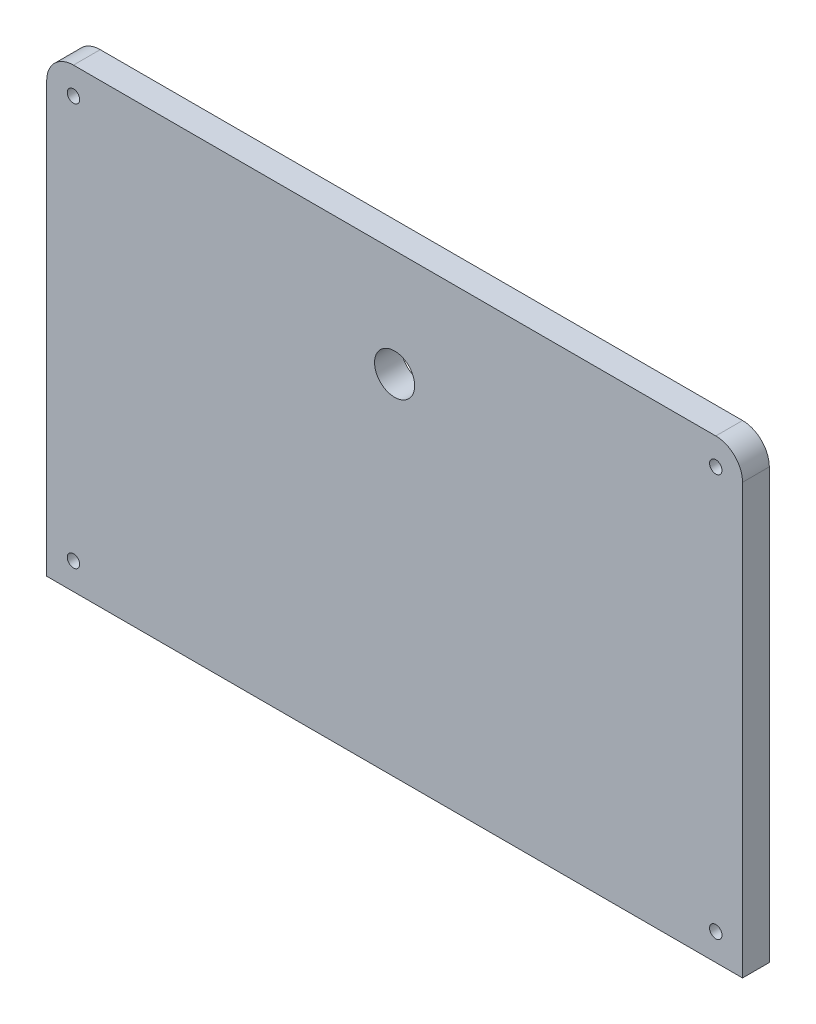
ISO-10303-21;
HEADER;
FILE_DESCRIPTION(('STEP AP214'),'2;1');
FILE_NAME('part.step','',(''),(''),'','','');
FILE_SCHEMA(('AUTOMOTIVE_DESIGN { 1 0 10303 214 1 1 1 1 }'));
ENDSEC;
DATA;
#1=APPLICATION_CONTEXT('core data for automotive mechanical design processes');
#2=APPLICATION_PROTOCOL_DEFINITION('international standard','automotive_design',2000,#1);
#3=PRODUCT_CONTEXT('',#1,'mechanical');
#4=PRODUCT('Part','Part','',(#3));
#5=PRODUCT_RELATED_PRODUCT_CATEGORY('part','',(#4));
#6=PRODUCT_DEFINITION_FORMATION('','',#4);
#7=PRODUCT_DEFINITION_CONTEXT('part definition',#1,'design');
#8=PRODUCT_DEFINITION('design','',#6,#7);
#9=PRODUCT_DEFINITION_SHAPE('','',#8);
#10=(LENGTH_UNIT() NAMED_UNIT(*) SI_UNIT(.MILLI.,.METRE.));
#11=(NAMED_UNIT(*) PLANE_ANGLE_UNIT() SI_UNIT($,.RADIAN.));
#12=(NAMED_UNIT(*) SI_UNIT($,.STERADIAN.) SOLID_ANGLE_UNIT());
#13=UNCERTAINTY_MEASURE_WITH_UNIT(LENGTH_MEASURE(1.E-05),#10,'distance_accuracy_value','');
#14=(GEOMETRIC_REPRESENTATION_CONTEXT(3) GLOBAL_UNCERTAINTY_ASSIGNED_CONTEXT((#13)) GLOBAL_UNIT_ASSIGNED_CONTEXT((#10,
#11,#12)) REPRESENTATION_CONTEXT('',''));
#15=CARTESIAN_POINT('',(0.,0.,0.));
#16=DIRECTION('',(0.,0.,1.));
#17=DIRECTION('',(1.,0.,0.));
#18=AXIS2_PLACEMENT_3D('',#15,#16,#17);
#19=CARTESIAN_POINT('',(158.75,101.854,6.35));
#20=DIRECTION('',(0.,0.,-1.));
#21=DIRECTION('',(-1.,0.,0.));
#22=AXIS2_PLACEMENT_3D('',#19,#20,#21);
#23=PLANE('',#22);
#24=CARTESIAN_POINT('',(6.35,101.854,6.35));
#25=DIRECTION('',(0.,0.,1.));
#26=DIRECTION('',(1.,0.,0.));
#27=AXIS2_PLACEMENT_3D('',#24,#25,#26);
#28=CIRCLE('',#27,1.4732);
#29=CARTESIAN_POINT('',(7.8232,101.854,6.35));
#30=VERTEX_POINT('',#29);
#31=EDGE_CURVE('E196',#30,#30,#28,.T.);
#32=ORIENTED_EDGE('',*,*,#31,.F.);
#33=EDGE_LOOP('',(#32));
#34=FACE_BOUND('',#33,.T.);
#35=CARTESIAN_POINT('',(158.75,6.35000000000001,6.35));
#36=DIRECTION('',(0.,0.,1.));
#37=DIRECTION('',(1.,0.,0.));
#38=AXIS2_PLACEMENT_3D('',#35,#36,#37);
#39=CIRCLE('',#38,1.4732);
#40=CARTESIAN_POINT('',(160.2232,6.35000000000001,6.35));
#41=VERTEX_POINT('',#40);
#42=EDGE_CURVE('E208',#41,#41,#39,.T.);
#43=ORIENTED_EDGE('',*,*,#42,.F.);
#44=EDGE_LOOP('',(#43));
#45=FACE_BOUND('',#44,.T.);
#46=CARTESIAN_POINT('',(158.75,101.854,6.35));
#47=DIRECTION('',(0.,0.,1.));
#48=DIRECTION('',(-1.,0.,0.));
#49=AXIS2_PLACEMENT_3D('',#46,#47,#48);
#50=CIRCLE('',#49,6.34999999999999);
#51=CARTESIAN_POINT('',(165.1,101.854,6.35));
#52=VERTEX_POINT('',#51);
#53=CARTESIAN_POINT('',(158.75,108.204,6.35));
#54=VERTEX_POINT('',#53);
#55=EDGE_CURVE('E131',#52,#54,#50,.T.);
#56=ORIENTED_EDGE('',*,*,#55,.T.);
#57=DIRECTION('',(-1.,0.,0.));
#58=VECTOR('',#57,1.);
#59=CARTESIAN_POINT('',(6.35000000000004,108.204,6.35));
#60=LINE('',#59,#58);
#61=CARTESIAN_POINT('',(6.35000000000004,108.204,6.35));
#62=VERTEX_POINT('',#61);
#63=EDGE_CURVE('E89',#54,#62,#60,.T.);
#64=ORIENTED_EDGE('',*,*,#63,.T.);
#65=CARTESIAN_POINT('',(6.35,101.854,6.35));
#66=DIRECTION('',(0.,0.,1.));
#67=DIRECTION('',(-1.,0.,0.));
#68=AXIS2_PLACEMENT_3D('',#65,#66,#67);
#69=CIRCLE('',#68,6.35);
#70=CARTESIAN_POINT('',(0.,101.854,6.35));
#71=VERTEX_POINT('',#70);
#72=EDGE_CURVE('E102',#62,#71,#69,.T.);
#73=ORIENTED_EDGE('',*,*,#72,.T.);
#74=DIRECTION('',(0.,-1.,0.));
#75=VECTOR('',#74,1.);
#76=CARTESIAN_POINT('',(0.,0.,6.35));
#77=LINE('',#76,#75);
#78=CARTESIAN_POINT('',(0.,0.,6.35));
#79=VERTEX_POINT('',#78);
#80=EDGE_CURVE('E96',#71,#79,#77,.T.);
#81=ORIENTED_EDGE('',*,*,#80,.T.);
#82=DIRECTION('',(1.,0.,0.));
#83=VECTOR('',#82,1.);
#84=CARTESIAN_POINT('',(0.,0.,6.35));
#85=LINE('',#84,#83);
#86=CARTESIAN_POINT('',(165.1,0.,6.35));
#87=VERTEX_POINT('',#86);
#88=EDGE_CURVE('E100',#79,#87,#85,.T.);
#89=ORIENTED_EDGE('',*,*,#88,.T.);
#90=DIRECTION('',(0.,1.,0.));
#91=VECTOR('',#90,1.);
#92=CARTESIAN_POINT('',(165.1,0.,6.35));
#93=LINE('',#92,#91);
#94=EDGE_CURVE('E52',#87,#52,#93,.T.);
#95=ORIENTED_EDGE('',*,*,#94,.T.);
#96=EDGE_LOOP('',(#56,#64,#73,#81,#89,#95));
#97=FACE_BOUND('',#96,.T.);
#98=CARTESIAN_POINT('',(6.35,6.35,6.35));
#99=DIRECTION('',(0.,0.,1.));
#100=DIRECTION('',(1.,0.,0.));
#101=AXIS2_PLACEMENT_3D('',#98,#99,#100);
#102=CIRCLE('',#101,1.4732);
#103=CARTESIAN_POINT('',(7.8232,6.35,6.35));
#104=VERTEX_POINT('',#103);
#105=EDGE_CURVE('E124',#104,#104,#102,.T.);
#106=ORIENTED_EDGE('',*,*,#105,.F.);
#107=EDGE_LOOP('',(#106));
#108=FACE_BOUND('',#107,.T.);
#109=CARTESIAN_POINT('',(158.75,101.854,6.35));
#110=DIRECTION('',(0.,0.,1.));
#111=DIRECTION('',(1.,0.,0.));
#112=AXIS2_PLACEMENT_3D('',#109,#110,#111);
#113=CIRCLE('',#112,1.4732);
#114=CARTESIAN_POINT('',(160.2232,101.854,6.35));
#115=VERTEX_POINT('',#114);
#116=EDGE_CURVE('E202',#115,#115,#113,.T.);
#117=ORIENTED_EDGE('',*,*,#116,.F.);
#118=EDGE_LOOP('',(#117));
#119=FACE_BOUND('',#118,.T.);
#120=CARTESIAN_POINT('',(82.55,82.804,6.35));
#121=DIRECTION('',(0.,0.,1.));
#122=DIRECTION('',(1.,0.,0.));
#123=AXIS2_PLACEMENT_3D('',#120,#121,#122);
#124=CIRCLE('',#123,4.7625);
#125=CARTESIAN_POINT('',(87.3125,82.804,6.35));
#126=VERTEX_POINT('',#125);
#127=EDGE_CURVE('E187',#126,#126,#124,.T.);
#128=ORIENTED_EDGE('',*,*,#127,.F.);
#129=EDGE_LOOP('',(#128));
#130=FACE_BOUND('',#129,.T.);
#131=ADVANCED_FACE('F35',(#34,#45,#97,#108,#119,#130),#23,.F.);
#132=CARTESIAN_POINT('',(158.75,101.854,0.));
#133=DIRECTION('',(0.,0.,-1.));
#134=DIRECTION('',(-1.,0.,0.));
#135=AXIS2_PLACEMENT_3D('',#132,#133,#134);
#136=PLANE('',#135);
#137=CARTESIAN_POINT('',(6.35,101.854,0.));
#138=DIRECTION('',(0.,0.,1.));
#139=DIRECTION('',(1.,0.,0.));
#140=AXIS2_PLACEMENT_3D('',#137,#138,#139);
#141=CIRCLE('',#140,1.4732);
#142=CARTESIAN_POINT('',(7.8232,101.854,0.));
#143=VERTEX_POINT('',#142);
#144=EDGE_CURVE('E193',#143,#143,#141,.T.);
#145=ORIENTED_EDGE('',*,*,#144,.T.);
#146=EDGE_LOOP('',(#145));
#147=FACE_BOUND('',#146,.T.);
#148=CARTESIAN_POINT('',(158.75,6.35000000000001,0.));
#149=DIRECTION('',(0.,0.,1.));
#150=DIRECTION('',(1.,0.,0.));
#151=AXIS2_PLACEMENT_3D('',#148,#149,#150);
#152=CIRCLE('',#151,1.4732);
#153=CARTESIAN_POINT('',(160.2232,6.35000000000001,0.));
#154=VERTEX_POINT('',#153);
#155=EDGE_CURVE('E205',#154,#154,#152,.T.);
#156=ORIENTED_EDGE('',*,*,#155,.T.);
#157=EDGE_LOOP('',(#156));
#158=FACE_BOUND('',#157,.T.);
#159=CARTESIAN_POINT('',(158.75,101.854,0.));
#160=DIRECTION('',(0.,0.,1.));
#161=DIRECTION('',(-1.,0.,0.));
#162=AXIS2_PLACEMENT_3D('',#159,#160,#161);
#163=CIRCLE('',#162,6.34999999999999);
#164=CARTESIAN_POINT('',(165.1,101.854,0.));
#165=VERTEX_POINT('',#164);
#166=CARTESIAN_POINT('',(158.75,108.204,0.));
#167=VERTEX_POINT('',#166);
#168=EDGE_CURVE('E120',#165,#167,#163,.T.);
#169=ORIENTED_EDGE('',*,*,#168,.F.);
#170=DIRECTION('',(0.,1.,0.));
#171=VECTOR('',#170,1.);
#172=CARTESIAN_POINT('',(165.1,0.,0.));
#173=LINE('',#172,#171);
#174=CARTESIAN_POINT('',(165.1,0.,0.));
#175=VERTEX_POINT('',#174);
#176=EDGE_CURVE('E81',#175,#165,#173,.T.);
#177=ORIENTED_EDGE('',*,*,#176,.F.);
#178=DIRECTION('',(1.,0.,0.));
#179=VECTOR('',#178,1.);
#180=CARTESIAN_POINT('',(0.,0.,0.));
#181=LINE('',#180,#179);
#182=CARTESIAN_POINT('',(0.,0.,0.));
#183=VERTEX_POINT('',#182);
#184=EDGE_CURVE('E75',#183,#175,#181,.T.);
#185=ORIENTED_EDGE('',*,*,#184,.F.);
#186=DIRECTION('',(0.,-1.,0.));
#187=VECTOR('',#186,1.);
#188=CARTESIAN_POINT('',(0.,0.,0.));
#189=LINE('',#188,#187);
#190=CARTESIAN_POINT('',(0.,101.854,0.));
#191=VERTEX_POINT('',#190);
#192=EDGE_CURVE('E110',#191,#183,#189,.T.);
#193=ORIENTED_EDGE('',*,*,#192,.F.);
#194=CARTESIAN_POINT('',(6.35,101.854,0.));
#195=DIRECTION('',(0.,0.,1.));
#196=DIRECTION('',(-1.,0.,0.));
#197=AXIS2_PLACEMENT_3D('',#194,#195,#196);
#198=CIRCLE('',#197,6.35);
#199=CARTESIAN_POINT('',(6.35000000000004,108.204,0.));
#200=VERTEX_POINT('',#199);
#201=EDGE_CURVE('E126',#200,#191,#198,.T.);
#202=ORIENTED_EDGE('',*,*,#201,.F.);
#203=DIRECTION('',(-1.,0.,0.));
#204=VECTOR('',#203,1.);
#205=CARTESIAN_POINT('',(6.35000000000004,108.204,0.));
#206=LINE('',#205,#204);
#207=EDGE_CURVE('E123',#167,#200,#206,.T.);
#208=ORIENTED_EDGE('',*,*,#207,.F.);
#209=EDGE_LOOP('',(#169,#177,#185,#193,#202,#208));
#210=FACE_BOUND('',#209,.T.);
#211=CARTESIAN_POINT('',(6.35,6.35,0.));
#212=DIRECTION('',(0.,0.,1.));
#213=DIRECTION('',(1.,0.,0.));
#214=AXIS2_PLACEMENT_3D('',#211,#212,#213);
#215=CIRCLE('',#214,1.4732);
#216=CARTESIAN_POINT('',(7.8232,6.35,0.));
#217=VERTEX_POINT('',#216);
#218=EDGE_CURVE('E211',#217,#217,#215,.T.);
#219=ORIENTED_EDGE('',*,*,#218,.T.);
#220=EDGE_LOOP('',(#219));
#221=FACE_BOUND('',#220,.T.);
#222=CARTESIAN_POINT('',(158.75,101.854,0.));
#223=DIRECTION('',(0.,0.,1.));
#224=DIRECTION('',(1.,0.,0.));
#225=AXIS2_PLACEMENT_3D('',#222,#223,#224);
#226=CIRCLE('',#225,1.4732);
#227=CARTESIAN_POINT('',(160.2232,101.854,0.));
#228=VERTEX_POINT('',#227);
#229=EDGE_CURVE('E199',#228,#228,#226,.T.);
#230=ORIENTED_EDGE('',*,*,#229,.T.);
#231=EDGE_LOOP('',(#230));
#232=FACE_BOUND('',#231,.T.);
#233=CARTESIAN_POINT('',(82.55,82.804,0.));
#234=DIRECTION('',(0.,0.,1.));
#235=DIRECTION('',(1.,0.,0.));
#236=AXIS2_PLACEMENT_3D('',#233,#234,#235);
#237=CIRCLE('',#236,4.7625);
#238=CARTESIAN_POINT('',(87.3125,82.804,0.));
#239=VERTEX_POINT('',#238);
#240=EDGE_CURVE('E190',#239,#239,#237,.T.);
#241=ORIENTED_EDGE('',*,*,#240,.T.);
#242=EDGE_LOOP('',(#241));
#243=FACE_BOUND('',#242,.T.);
#244=ADVANCED_FACE('F140',(#147,#158,#210,#221,#232,#243),#136,.T.);
#245=CARTESIAN_POINT('',(158.75,101.854,6.35));
#246=DIRECTION('',(0.,0.,-1.));
#247=DIRECTION('',(-1.,0.,0.));
#248=AXIS2_PLACEMENT_3D('',#245,#246,#247);
#249=CYLINDRICAL_SURFACE('',#248,6.34999999999999);
#250=ORIENTED_EDGE('',*,*,#168,.T.);
#251=DIRECTION('',(0.,0.,-1.));
#252=VECTOR('',#251,1.);
#253=CARTESIAN_POINT('',(158.75,108.204,6.35));
#254=LINE('',#253,#252);
#255=EDGE_CURVE('E11',#54,#167,#254,.T.);
#256=ORIENTED_EDGE('',*,*,#255,.F.);
#257=ORIENTED_EDGE('',*,*,#55,.F.);
#258=DIRECTION('',(0.,0.,-1.));
#259=VECTOR('',#258,1.);
#260=CARTESIAN_POINT('',(165.1,101.854,6.35));
#261=LINE('',#260,#259);
#262=EDGE_CURVE('E116',#52,#165,#261,.T.);
#263=ORIENTED_EDGE('',*,*,#262,.T.);
#264=EDGE_LOOP('',(#250,#256,#257,#263));
#265=FACE_BOUND('',#264,.T.);
#266=ADVANCED_FACE('F37',(#265),#249,.T.);
#267=CARTESIAN_POINT('',(6.35000000000004,108.204,6.35));
#268=DIRECTION('',(0.,-1.,0.));
#269=DIRECTION('',(1.,0.,0.));
#270=AXIS2_PLACEMENT_3D('',#267,#268,#269);
#271=PLANE('',#270);
#272=ORIENTED_EDGE('',*,*,#207,.T.);
#273=DIRECTION('',(0.,0.,-1.));
#274=VECTOR('',#273,1.);
#275=CARTESIAN_POINT('',(6.35000000000004,108.204,6.35));
#276=LINE('',#275,#274);
#277=EDGE_CURVE('E44',#62,#200,#276,.T.);
#278=ORIENTED_EDGE('',*,*,#277,.F.);
#279=ORIENTED_EDGE('',*,*,#63,.F.);
#280=ORIENTED_EDGE('',*,*,#255,.T.);
#281=EDGE_LOOP('',(#272,#278,#279,#280));
#282=FACE_BOUND('',#281,.T.);
#283=ADVANCED_FACE('F277',(#282),#271,.F.);
#284=CARTESIAN_POINT('',(6.35,101.854,6.35));
#285=DIRECTION('',(0.,0.,-1.));
#286=DIRECTION('',(-1.,0.,0.));
#287=AXIS2_PLACEMENT_3D('',#284,#285,#286);
#288=CYLINDRICAL_SURFACE('',#287,6.35);
#289=ORIENTED_EDGE('',*,*,#201,.T.);
#290=DIRECTION('',(0.,0.,-1.));
#291=VECTOR('',#290,1.);
#292=CARTESIAN_POINT('',(0.,101.854,6.35));
#293=LINE('',#292,#291);
#294=EDGE_CURVE('E111',#71,#191,#293,.T.);
#295=ORIENTED_EDGE('',*,*,#294,.F.);
#296=ORIENTED_EDGE('',*,*,#72,.F.);
#297=ORIENTED_EDGE('',*,*,#277,.T.);
#298=EDGE_LOOP('',(#289,#295,#296,#297));
#299=FACE_BOUND('',#298,.T.);
#300=ADVANCED_FACE('F137',(#299),#288,.T.);
#301=CARTESIAN_POINT('',(0.,0.,6.35));
#302=DIRECTION('',(1.,0.,0.));
#303=DIRECTION('',(0.,0.,-1.));
#304=AXIS2_PLACEMENT_3D('',#301,#302,#303);
#305=PLANE('',#304);
#306=ORIENTED_EDGE('',*,*,#192,.T.);
#307=DIRECTION('',(0.,0.,-1.));
#308=VECTOR('',#307,1.);
#309=CARTESIAN_POINT('',(0.,0.,6.35));
#310=LINE('',#309,#308);
#311=EDGE_CURVE('E107',#79,#183,#310,.T.);
#312=ORIENTED_EDGE('',*,*,#311,.F.);
#313=ORIENTED_EDGE('',*,*,#80,.F.);
#314=ORIENTED_EDGE('',*,*,#294,.T.);
#315=EDGE_LOOP('',(#306,#312,#313,#314));
#316=FACE_BOUND('',#315,.T.);
#317=ADVANCED_FACE('F108',(#316),#305,.F.);
#318=CARTESIAN_POINT('',(0.,0.,6.35));
#319=DIRECTION('',(0.,1.,0.));
#320=DIRECTION('',(-1.,0.,0.));
#321=AXIS2_PLACEMENT_3D('',#318,#319,#320);
#322=PLANE('',#321);
#323=ORIENTED_EDGE('',*,*,#184,.T.);
#324=DIRECTION('',(0.,0.,-1.));
#325=VECTOR('',#324,1.);
#326=CARTESIAN_POINT('',(165.1,0.,6.35));
#327=LINE('',#326,#325);
#328=EDGE_CURVE('E112',#87,#175,#327,.T.);
#329=ORIENTED_EDGE('',*,*,#328,.F.);
#330=ORIENTED_EDGE('',*,*,#88,.F.);
#331=ORIENTED_EDGE('',*,*,#311,.T.);
#332=EDGE_LOOP('',(#323,#329,#330,#331));
#333=FACE_BOUND('',#332,.T.);
#334=ADVANCED_FACE('F114',(#333),#322,.F.);
#335=CARTESIAN_POINT('',(165.1,0.,6.35));
#336=DIRECTION('',(-1.,0.,0.));
#337=DIRECTION('',(0.,0.,1.));
#338=AXIS2_PLACEMENT_3D('',#335,#336,#337);
#339=PLANE('',#338);
#340=ORIENTED_EDGE('',*,*,#176,.T.);
#341=ORIENTED_EDGE('',*,*,#262,.F.);
#342=ORIENTED_EDGE('',*,*,#94,.F.);
#343=ORIENTED_EDGE('',*,*,#328,.T.);
#344=EDGE_LOOP('',(#340,#341,#342,#343));
#345=FACE_BOUND('',#344,.T.);
#346=ADVANCED_FACE('F145',(#345),#339,.F.);
#347=CARTESIAN_POINT('',(6.35,6.35,6.35));
#348=DIRECTION('',(0.,0.,-1.));
#349=DIRECTION('',(-1.,0.,0.));
#350=AXIS2_PLACEMENT_3D('',#347,#348,#349);
#351=CYLINDRICAL_SURFACE('',#350,1.4732);
#352=ORIENTED_EDGE('',*,*,#105,.T.);
#353=EDGE_LOOP('',(#352));
#354=FACE_BOUND('',#353,.T.);
#355=ORIENTED_EDGE('',*,*,#218,.F.);
#356=EDGE_LOOP('',(#355));
#357=FACE_BOUND('',#356,.T.);
#358=ADVANCED_FACE('F147',(#354,#357),#351,.F.);
#359=CARTESIAN_POINT('',(158.75,6.35000000000001,6.35));
#360=DIRECTION('',(0.,0.,-1.));
#361=DIRECTION('',(-1.,0.,0.));
#362=AXIS2_PLACEMENT_3D('',#359,#360,#361);
#363=CYLINDRICAL_SURFACE('',#362,1.4732);
#364=ORIENTED_EDGE('',*,*,#42,.T.);
#365=EDGE_LOOP('',(#364));
#366=FACE_BOUND('',#365,.T.);
#367=ORIENTED_EDGE('',*,*,#155,.F.);
#368=EDGE_LOOP('',(#367));
#369=FACE_BOUND('',#368,.T.);
#370=ADVANCED_FACE('F153',(#366,#369),#363,.F.);
#371=CARTESIAN_POINT('',(158.75,101.854,6.35));
#372=DIRECTION('',(0.,0.,-1.));
#373=DIRECTION('',(-1.,0.,0.));
#374=AXIS2_PLACEMENT_3D('',#371,#372,#373);
#375=CYLINDRICAL_SURFACE('',#374,1.4732);
#376=ORIENTED_EDGE('',*,*,#116,.T.);
#377=EDGE_LOOP('',(#376));
#378=FACE_BOUND('',#377,.T.);
#379=ORIENTED_EDGE('',*,*,#229,.F.);
#380=EDGE_LOOP('',(#379));
#381=FACE_BOUND('',#380,.T.);
#382=ADVANCED_FACE('F170',(#378,#381),#375,.F.);
#383=CARTESIAN_POINT('',(6.35,101.854,6.35));
#384=DIRECTION('',(0.,0.,-1.));
#385=DIRECTION('',(-1.,0.,0.));
#386=AXIS2_PLACEMENT_3D('',#383,#384,#385);
#387=CYLINDRICAL_SURFACE('',#386,1.4732);
#388=ORIENTED_EDGE('',*,*,#31,.T.);
#389=EDGE_LOOP('',(#388));
#390=FACE_BOUND('',#389,.T.);
#391=ORIENTED_EDGE('',*,*,#144,.F.);
#392=EDGE_LOOP('',(#391));
#393=FACE_BOUND('',#392,.T.);
#394=ADVANCED_FACE('F174',(#390,#393),#387,.F.);
#395=CARTESIAN_POINT('',(82.55,82.804,6.35));
#396=DIRECTION('',(0.,0.,-1.));
#397=DIRECTION('',(-1.,0.,0.));
#398=AXIS2_PLACEMENT_3D('',#395,#396,#397);
#399=CYLINDRICAL_SURFACE('',#398,4.7625);
#400=ORIENTED_EDGE('',*,*,#127,.T.);
#401=EDGE_LOOP('',(#400));
#402=FACE_BOUND('',#401,.T.);
#403=ORIENTED_EDGE('',*,*,#240,.F.);
#404=EDGE_LOOP('',(#403));
#405=FACE_BOUND('',#404,.T.);
#406=ADVANCED_FACE('F178',(#402,#405),#399,.F.);
#407=CLOSED_SHELL('',(#131,#244,#266,#283,#300,#317,#334,#346,#358,#370,#382,#394,#406));
#408=MANIFOLD_SOLID_BREP('B2',#407);
#409=ADVANCED_BREP_SHAPE_REPRESENTATION('',(#18,#408),#14);
#410=SHAPE_DEFINITION_REPRESENTATION(#9,#409);
ENDSEC;
END-ISO-10303-21;
